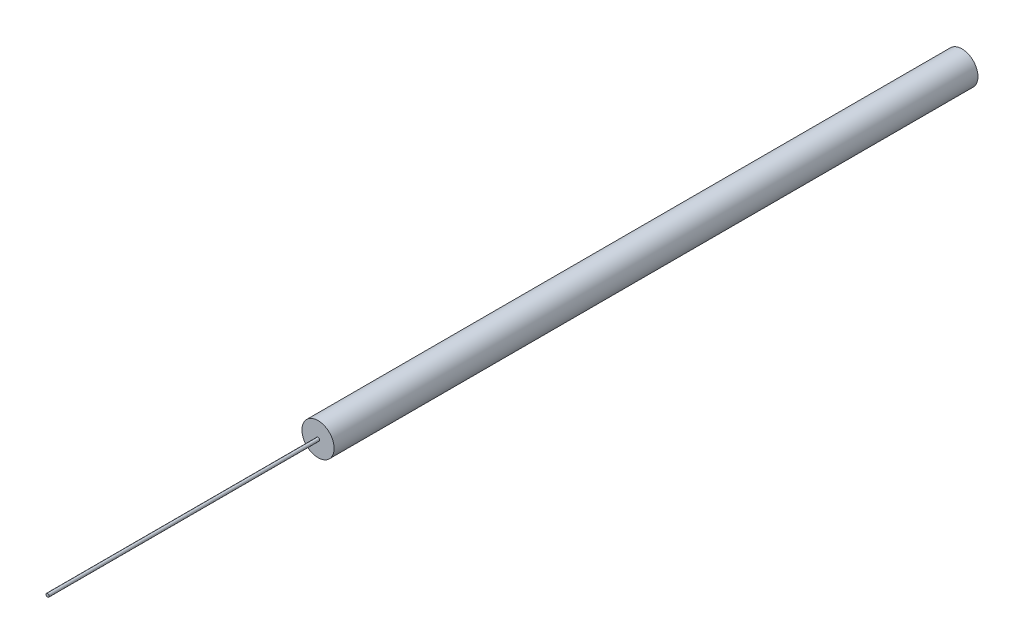
ISO-10303-21;
HEADER;
FILE_DESCRIPTION(('STEP AP214'),'2;1');
FILE_NAME('part.step','',(''),(''),'','','');
FILE_SCHEMA(('AUTOMOTIVE_DESIGN { 1 0 10303 214 1 1 1 1 }'));
ENDSEC;
DATA;
#1=APPLICATION_CONTEXT('core data for automotive mechanical design processes');
#2=APPLICATION_PROTOCOL_DEFINITION('international standard','automotive_design',2000,#1);
#3=PRODUCT_CONTEXT('',#1,'mechanical');
#4=PRODUCT('Part','Part','',(#3));
#5=PRODUCT_RELATED_PRODUCT_CATEGORY('part','',(#4));
#6=PRODUCT_DEFINITION_FORMATION('','',#4);
#7=PRODUCT_DEFINITION_CONTEXT('part definition',#1,'design');
#8=PRODUCT_DEFINITION('design','',#6,#7);
#9=PRODUCT_DEFINITION_SHAPE('','',#8);
#10=(LENGTH_UNIT() NAMED_UNIT(*) SI_UNIT(.MILLI.,.METRE.));
#11=(NAMED_UNIT(*) PLANE_ANGLE_UNIT() SI_UNIT($,.RADIAN.));
#12=(NAMED_UNIT(*) SI_UNIT($,.STERADIAN.) SOLID_ANGLE_UNIT());
#13=UNCERTAINTY_MEASURE_WITH_UNIT(LENGTH_MEASURE(1.E-05),#10,'distance_accuracy_value','');
#14=(GEOMETRIC_REPRESENTATION_CONTEXT(3) GLOBAL_UNCERTAINTY_ASSIGNED_CONTEXT((#13)) GLOBAL_UNIT_ASSIGNED_CONTEXT((#10,
#11,#12)) REPRESENTATION_CONTEXT('',''));
#15=CARTESIAN_POINT('',(0.,0.,0.));
#16=DIRECTION('',(0.,0.,1.));
#17=DIRECTION('',(1.,0.,0.));
#18=AXIS2_PLACEMENT_3D('',#15,#16,#17);
#19=CARTESIAN_POINT('',(0.,0.,200.));
#20=DIRECTION('',(0.,0.,-1.));
#21=DIRECTION('',(-1.,0.,0.));
#22=AXIS2_PLACEMENT_3D('',#19,#20,#21);
#23=CYLINDRICAL_SURFACE('',#22,5.);
#24=CARTESIAN_POINT('',(0.,0.,200.));
#25=DIRECTION('',(0.,0.,1.));
#26=DIRECTION('',(1.,0.,0.));
#27=AXIS2_PLACEMENT_3D('',#24,#25,#26);
#28=CIRCLE('',#27,5.);
#29=CARTESIAN_POINT('',(5.,0.,200.));
#30=VERTEX_POINT('',#29);
#31=EDGE_CURVE('E10',#30,#30,#28,.T.);
#32=ORIENTED_EDGE('',*,*,#31,.F.);
#33=EDGE_LOOP('',(#32));
#34=FACE_BOUND('',#33,.T.);
#35=CARTESIAN_POINT('',(0.,0.,0.));
#36=DIRECTION('',(0.,0.,1.));
#37=DIRECTION('',(1.,0.,0.));
#38=AXIS2_PLACEMENT_3D('',#35,#36,#37);
#39=CIRCLE('',#38,5.);
#40=CARTESIAN_POINT('',(5.,0.,0.));
#41=VERTEX_POINT('',#40);
#42=EDGE_CURVE('E40',#41,#41,#39,.T.);
#43=ORIENTED_EDGE('',*,*,#42,.T.);
#44=EDGE_LOOP('',(#43));
#45=FACE_BOUND('',#44,.T.);
#46=ADVANCED_FACE('F37',(#34,#45),#23,.T.);
#47=CARTESIAN_POINT('',(0.,0.,200.));
#48=DIRECTION('',(0.,0.,1.));
#49=DIRECTION('',(1.,0.,0.));
#50=AXIS2_PLACEMENT_3D('',#47,#48,#49);
#51=PLANE('',#50);
#52=CARTESIAN_POINT('',(0.,0.,200.));
#53=DIRECTION('',(0.,0.,1.));
#54=DIRECTION('',(1.,0.,0.));
#55=AXIS2_PLACEMENT_3D('',#52,#53,#54);
#56=CIRCLE('',#55,0.5);
#57=CARTESIAN_POINT('',(0.5,0.,200.));
#58=VERTEX_POINT('',#57);
#59=EDGE_CURVE('E49',#58,#58,#56,.T.);
#60=ORIENTED_EDGE('',*,*,#59,.F.);
#61=EDGE_LOOP('',(#60));
#62=FACE_BOUND('',#61,.T.);
#63=ORIENTED_EDGE('',*,*,#31,.T.);
#64=EDGE_LOOP('',(#63));
#65=FACE_BOUND('',#64,.T.);
#66=ADVANCED_FACE('F64',(#62,#65),#51,.T.);
#67=CARTESIAN_POINT('',(0.,0.,0.));
#68=DIRECTION('',(0.,0.,1.));
#69=DIRECTION('',(1.,0.,0.));
#70=AXIS2_PLACEMENT_3D('',#67,#68,#69);
#71=PLANE('',#70);
#72=ORIENTED_EDGE('',*,*,#42,.F.);
#73=EDGE_LOOP('',(#72));
#74=FACE_BOUND('',#73,.T.);
#75=ADVANCED_FACE('F60',(#74),#71,.F.);
#76=CARTESIAN_POINT('',(0.,0.,284.));
#77=DIRECTION('',(0.,0.,-1.));
#78=DIRECTION('',(-1.,0.,0.));
#79=AXIS2_PLACEMENT_3D('',#76,#77,#78);
#80=CYLINDRICAL_SURFACE('',#79,0.5);
#81=CARTESIAN_POINT('',(0.,0.,284.));
#82=DIRECTION('',(0.,0.,1.));
#83=DIRECTION('',(1.,0.,0.));
#84=AXIS2_PLACEMENT_3D('',#81,#82,#83);
#85=CIRCLE('',#84,0.5);
#86=CARTESIAN_POINT('',(0.5,0.,284.));
#87=VERTEX_POINT('',#86);
#88=EDGE_CURVE('E47',#87,#87,#85,.T.);
#89=ORIENTED_EDGE('',*,*,#88,.F.);
#90=EDGE_LOOP('',(#89));
#91=FACE_BOUND('',#90,.T.);
#92=ORIENTED_EDGE('',*,*,#59,.T.);
#93=EDGE_LOOP('',(#92));
#94=FACE_BOUND('',#93,.T.);
#95=ADVANCED_FACE('F57',(#91,#94),#80,.T.);
#96=CARTESIAN_POINT('',(0.,0.,284.));
#97=DIRECTION('',(0.,0.,1.));
#98=DIRECTION('',(1.,0.,0.));
#99=AXIS2_PLACEMENT_3D('',#96,#97,#98);
#100=PLANE('',#99);
#101=ORIENTED_EDGE('',*,*,#88,.T.);
#102=EDGE_LOOP('',(#101));
#103=FACE_BOUND('',#102,.T.);
#104=ADVANCED_FACE('F55',(#103),#100,.T.);
#105=CLOSED_SHELL('',(#46,#66,#75,#95,#104));
#106=MANIFOLD_SOLID_BREP('B2',#105);
#107=ADVANCED_BREP_SHAPE_REPRESENTATION('',(#18,#106),#14);
#108=SHAPE_DEFINITION_REPRESENTATION(#9,#107);
ENDSEC;
END-ISO-10303-21;
